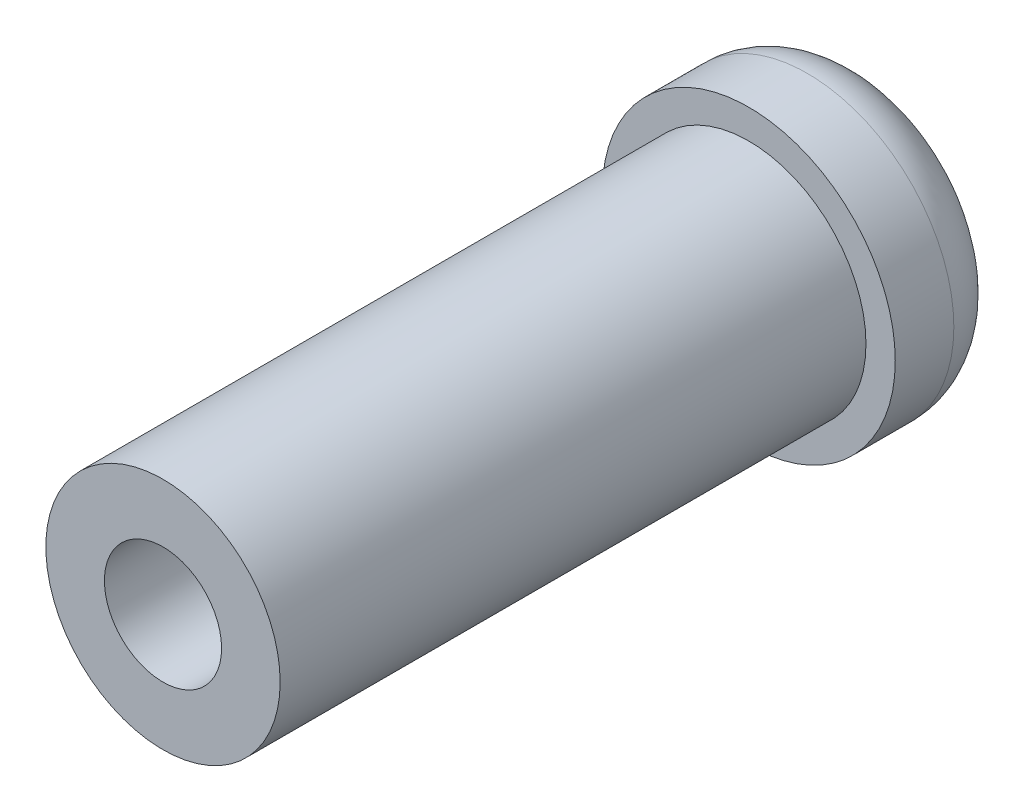
ISO-10303-21;
HEADER;
FILE_DESCRIPTION(('STEP AP214'),'2;1');
FILE_NAME('part.step','',(''),(''),'','','');
FILE_SCHEMA(('AUTOMOTIVE_DESIGN { 1 0 10303 214 1 1 1 1 }'));
ENDSEC;
DATA;
#1=APPLICATION_CONTEXT('core data for automotive mechanical design processes');
#2=APPLICATION_PROTOCOL_DEFINITION('international standard','automotive_design',2000,#1);
#3=PRODUCT_CONTEXT('',#1,'mechanical');
#4=PRODUCT('Part','Part','',(#3));
#5=PRODUCT_RELATED_PRODUCT_CATEGORY('part','',(#4));
#6=PRODUCT_DEFINITION_FORMATION('','',#4);
#7=PRODUCT_DEFINITION_CONTEXT('part definition',#1,'design');
#8=PRODUCT_DEFINITION('design','',#6,#7);
#9=PRODUCT_DEFINITION_SHAPE('','',#8);
#10=(LENGTH_UNIT() NAMED_UNIT(*) SI_UNIT(.MILLI.,.METRE.));
#11=(NAMED_UNIT(*) PLANE_ANGLE_UNIT() SI_UNIT($,.RADIAN.));
#12=(NAMED_UNIT(*) SI_UNIT($,.STERADIAN.) SOLID_ANGLE_UNIT());
#13=UNCERTAINTY_MEASURE_WITH_UNIT(LENGTH_MEASURE(1.E-05),#10,'distance_accuracy_value','');
#14=(GEOMETRIC_REPRESENTATION_CONTEXT(3) GLOBAL_UNCERTAINTY_ASSIGNED_CONTEXT((#13)) GLOBAL_UNIT_ASSIGNED_CONTEXT((#10,
#11,#12)) REPRESENTATION_CONTEXT('',''));
#15=CARTESIAN_POINT('',(0.,0.,0.));
#16=DIRECTION('',(0.,0.,1.));
#17=DIRECTION('',(1.,0.,0.));
#18=AXIS2_PLACEMENT_3D('',#15,#16,#17);
#19=CARTESIAN_POINT('',(0.,0.,2.));
#20=DIRECTION('',(0.,0.,-1.));
#21=DIRECTION('',(-1.,0.,0.));
#22=AXIS2_PLACEMENT_3D('',#19,#20,#21);
#23=CYLINDRICAL_SURFACE('',#22,2.5);
#24=CARTESIAN_POINT('',(0.,0.,1.));
#25=DIRECTION('',(0.,0.,1.));
#26=DIRECTION('',(1.,0.,0.));
#27=AXIS2_PLACEMENT_3D('',#24,#25,#26);
#28=CIRCLE('',#27,2.5);
#29=CARTESIAN_POINT('',(2.5,0.,1.));
#30=VERTEX_POINT('',#29);
#31=EDGE_CURVE('E38',#30,#30,#28,.T.);
#32=ORIENTED_EDGE('',*,*,#31,.T.);
#33=EDGE_LOOP('',(#32));
#34=FACE_BOUND('',#33,.T.);
#35=CARTESIAN_POINT('',(0.,0.,2.));
#36=DIRECTION('',(0.,0.,1.));
#37=DIRECTION('',(1.,0.,0.));
#38=AXIS2_PLACEMENT_3D('',#35,#36,#37);
#39=CIRCLE('',#38,2.5);
#40=CARTESIAN_POINT('',(2.5,0.,2.));
#41=VERTEX_POINT('',#40);
#42=EDGE_CURVE('E46',#41,#41,#39,.T.);
#43=ORIENTED_EDGE('',*,*,#42,.F.);
#44=EDGE_LOOP('',(#43));
#45=FACE_BOUND('',#44,.T.);
#46=ADVANCED_FACE('F31',(#34,#45),#23,.T.);
#47=CARTESIAN_POINT('',(0.,0.,2.));
#48=DIRECTION('',(0.,0.,1.));
#49=DIRECTION('',(1.,0.,0.));
#50=AXIS2_PLACEMENT_3D('',#47,#48,#49);
#51=PLANE('',#50);
#52=CARTESIAN_POINT('',(0.,0.,2.));
#53=DIRECTION('',(0.,0.,1.));
#54=DIRECTION('',(1.,0.,0.));
#55=AXIS2_PLACEMENT_3D('',#52,#53,#54);
#56=CIRCLE('',#55,2.);
#57=CARTESIAN_POINT('',(2.,0.,2.));
#58=VERTEX_POINT('',#57);
#59=EDGE_CURVE('E52',#58,#58,#56,.T.);
#60=ORIENTED_EDGE('',*,*,#59,.F.);
#61=EDGE_LOOP('',(#60));
#62=FACE_BOUND('',#61,.T.);
#63=ORIENTED_EDGE('',*,*,#42,.T.);
#64=EDGE_LOOP('',(#63));
#65=FACE_BOUND('',#64,.T.);
#66=ADVANCED_FACE('F76',(#62,#65),#51,.T.);
#67=CARTESIAN_POINT('',(0.,0.,0.));
#68=DIRECTION('',(0.,0.,1.));
#69=DIRECTION('',(1.,0.,0.));
#70=AXIS2_PLACEMENT_3D('',#67,#68,#69);
#71=PLANE('',#70);
#72=CARTESIAN_POINT('',(0.,0.,0.));
#73=DIRECTION('',(0.,0.,1.));
#74=DIRECTION('',(1.,0.,0.));
#75=AXIS2_PLACEMENT_3D('',#72,#73,#74);
#76=CIRCLE('',#75,1.5);
#77=CARTESIAN_POINT('',(1.5,0.,0.));
#78=VERTEX_POINT('',#77);
#79=EDGE_CURVE('E10',#78,#78,#76,.F.);
#80=ORIENTED_EDGE('',*,*,#79,.T.);
#81=EDGE_LOOP('',(#80));
#82=FACE_BOUND('',#81,.T.);
#83=ADVANCED_FACE('F67',(#82),#71,.F.);
#84=CARTESIAN_POINT('',(0.,0.,12.));
#85=DIRECTION('',(0.,0.,1.));
#86=DIRECTION('',(1.,0.,0.));
#87=AXIS2_PLACEMENT_3D('',#84,#85,#86);
#88=PLANE('',#87);
#89=CARTESIAN_POINT('',(0.,0.,12.));
#90=DIRECTION('',(0.,0.,1.));
#91=DIRECTION('',(1.,0.,0.));
#92=AXIS2_PLACEMENT_3D('',#89,#90,#91);
#93=CIRCLE('',#92,2.);
#94=CARTESIAN_POINT('',(2.,0.,12.));
#95=VERTEX_POINT('',#94);
#96=EDGE_CURVE('E51',#95,#95,#93,.T.);
#97=ORIENTED_EDGE('',*,*,#96,.T.);
#98=EDGE_LOOP('',(#97));
#99=FACE_BOUND('',#98,.T.);
#100=CARTESIAN_POINT('',(0.,0.,12.));
#101=DIRECTION('',(0.,0.,1.));
#102=DIRECTION('',(1.,0.,0.));
#103=AXIS2_PLACEMENT_3D('',#100,#101,#102);
#104=CIRCLE('',#103,0.999999999999999);
#105=CARTESIAN_POINT('',(0.999999999999999,0.,12.));
#106=VERTEX_POINT('',#105);
#107=EDGE_CURVE('E55',#106,#106,#104,.T.);
#108=ORIENTED_EDGE('',*,*,#107,.F.);
#109=EDGE_LOOP('',(#108));
#110=FACE_BOUND('',#109,.T.);
#111=ADVANCED_FACE('F64',(#99,#110),#88,.T.);
#112=CARTESIAN_POINT('',(0.,0.,12.));
#113=DIRECTION('',(0.,0.,-1.));
#114=DIRECTION('',(-1.,0.,0.));
#115=AXIS2_PLACEMENT_3D('',#112,#113,#114);
#116=CYLINDRICAL_SURFACE('',#115,2.);
#117=ORIENTED_EDGE('',*,*,#96,.F.);
#118=EDGE_LOOP('',(#117));
#119=FACE_BOUND('',#118,.T.);
#120=ORIENTED_EDGE('',*,*,#59,.T.);
#121=EDGE_LOOP('',(#120));
#122=FACE_BOUND('',#121,.T.);
#123=ADVANCED_FACE('F66',(#119,#122),#116,.T.);
#124=CARTESIAN_POINT('',(0.,0.,12.));
#125=DIRECTION('',(0.,0.,-1.));
#126=DIRECTION('',(-1.,0.,0.));
#127=AXIS2_PLACEMENT_3D('',#124,#125,#126);
#128=CYLINDRICAL_SURFACE('',#127,0.999999999999999);
#129=ORIENTED_EDGE('',*,*,#107,.T.);
#130=EDGE_LOOP('',(#129));
#131=FACE_BOUND('',#130,.T.);
#132=CARTESIAN_POINT('',(0.,0.,2.));
#133=DIRECTION('',(0.,0.,1.));
#134=DIRECTION('',(1.,0.,0.));
#135=AXIS2_PLACEMENT_3D('',#132,#133,#134);
#136=CIRCLE('',#135,0.999999999999999);
#137=CARTESIAN_POINT('',(0.999999999999999,0.,2.));
#138=VERTEX_POINT('',#137);
#139=EDGE_CURVE('E42',#138,#138,#136,.F.);
#140=ORIENTED_EDGE('',*,*,#139,.T.);
#141=EDGE_LOOP('',(#140));
#142=FACE_BOUND('',#141,.T.);
#143=ADVANCED_FACE('F61',(#131,#142),#128,.F.);
#144=ORIENTED_EDGE('',*,*,#139,.F.);
#145=EDGE_LOOP('',(#144));
#146=FACE_BOUND('',#145,.T.);
#147=ADVANCED_FACE('F85',(#146),#51,.T.);
#148=CARTESIAN_POINT('',(0.,0.,1.));
#149=DIRECTION('',(0.,0.,1.));
#150=DIRECTION('',(1.,0.,0.));
#151=AXIS2_PLACEMENT_3D('',#148,#149,#150);
#152=TOROIDAL_SURFACE('',#151,1.5,1.);
#153=ORIENTED_EDGE('',*,*,#79,.F.);
#154=EDGE_LOOP('',(#153));
#155=FACE_BOUND('',#154,.T.);
#156=ORIENTED_EDGE('',*,*,#31,.F.);
#157=EDGE_LOOP('',(#156));
#158=FACE_BOUND('',#157,.T.);
#159=ADVANCED_FACE('F33',(#155,#158),#152,.T.);
#160=CLOSED_SHELL('',(#46,#66,#83,#111,#123,#143,#147,#159));
#161=MANIFOLD_SOLID_BREP('B2',#160);
#162=ADVANCED_BREP_SHAPE_REPRESENTATION('',(#18,#161),#14);
#163=SHAPE_DEFINITION_REPRESENTATION(#9,#162);
ENDSEC;
END-ISO-10303-21;
